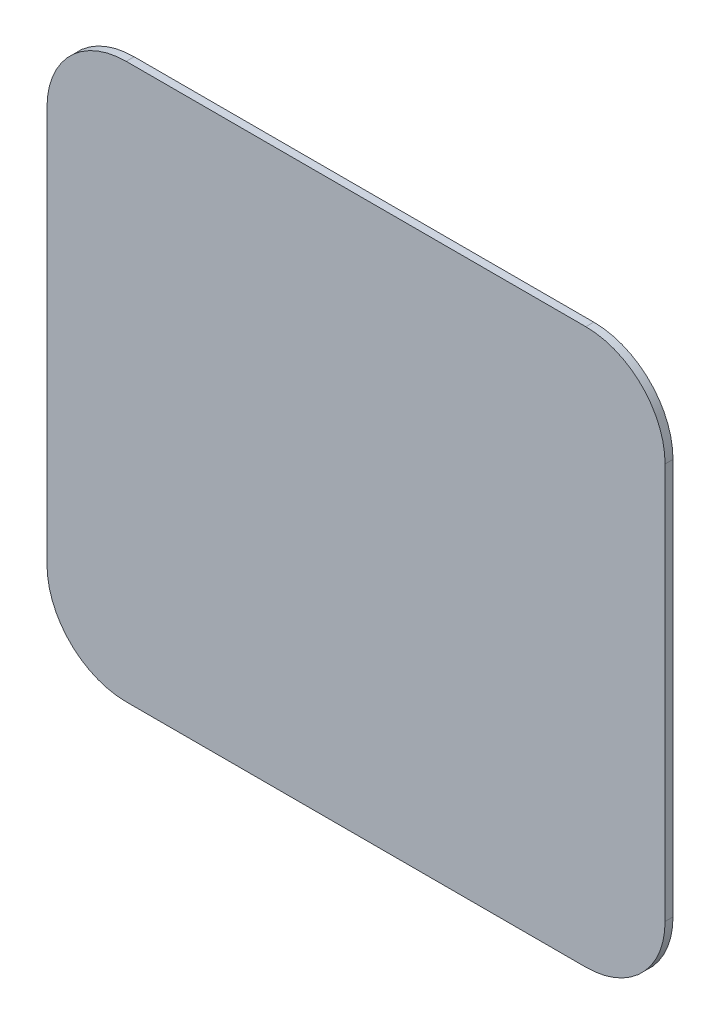
ISO-10303-21;
HEADER;
FILE_DESCRIPTION(('STEP AP214'),'2;1');
FILE_NAME('part.step','',(''),(''),'','','');
FILE_SCHEMA(('AUTOMOTIVE_DESIGN { 1 0 10303 214 1 1 1 1 }'));
ENDSEC;
DATA;
#1=APPLICATION_CONTEXT('core data for automotive mechanical design processes');
#2=APPLICATION_PROTOCOL_DEFINITION('international standard','automotive_design',2000,#1);
#3=PRODUCT_CONTEXT('',#1,'mechanical');
#4=PRODUCT('Part','Part','',(#3));
#5=PRODUCT_RELATED_PRODUCT_CATEGORY('part','',(#4));
#6=PRODUCT_DEFINITION_FORMATION('','',#4);
#7=PRODUCT_DEFINITION_CONTEXT('part definition',#1,'design');
#8=PRODUCT_DEFINITION('design','',#6,#7);
#9=PRODUCT_DEFINITION_SHAPE('','',#8);
#10=(LENGTH_UNIT() NAMED_UNIT(*) SI_UNIT(.MILLI.,.METRE.));
#11=(NAMED_UNIT(*) PLANE_ANGLE_UNIT() SI_UNIT($,.RADIAN.));
#12=(NAMED_UNIT(*) SI_UNIT($,.STERADIAN.) SOLID_ANGLE_UNIT());
#13=UNCERTAINTY_MEASURE_WITH_UNIT(LENGTH_MEASURE(1.E-05),#10,'distance_accuracy_value','');
#14=(GEOMETRIC_REPRESENTATION_CONTEXT(3) GLOBAL_UNCERTAINTY_ASSIGNED_CONTEXT((#13)) GLOBAL_UNIT_ASSIGNED_CONTEXT((#10,
#11,#12)) REPRESENTATION_CONTEXT('',''));
#15=CARTESIAN_POINT('',(0.,0.,0.));
#16=DIRECTION('',(0.,0.,1.));
#17=DIRECTION('',(1.,0.,0.));
#18=AXIS2_PLACEMENT_3D('',#15,#16,#17);
#19=CARTESIAN_POINT('',(38.9246009024166,39.9501900989278,1.));
#20=DIRECTION('',(-1.,0.,0.));
#21=DIRECTION('',(0.,-1.,0.));
#22=AXIS2_PLACEMENT_3D('',#19,#20,#21);
#23=PLANE('',#22);
#24=DIRECTION('',(0.,1.,0.));
#25=VECTOR('',#24,1.);
#26=CARTESIAN_POINT('',(38.9246009024166,39.9501900989278,1.));
#27=LINE('',#26,#25);
#28=CARTESIAN_POINT('',(38.9246009024166,-20.0498099010722,1.));
#29=VERTEX_POINT('',#28);
#30=CARTESIAN_POINT('',(38.9246009024166,29.9501900989278,1.));
#31=VERTEX_POINT('',#30);
#32=EDGE_CURVE('E128',#29,#31,#27,.T.);
#33=ORIENTED_EDGE('',*,*,#32,.F.);
#34=DIRECTION('',(0.,0.,-1.));
#35=VECTOR('',#34,1.);
#36=CARTESIAN_POINT('',(38.9246009024166,-20.0498099010722,1.));
#37=LINE('',#36,#35);
#38=CARTESIAN_POINT('',(38.9246009024166,-20.0498099010722,0.));
#39=VERTEX_POINT('',#38);
#40=EDGE_CURVE('E11',#29,#39,#37,.T.);
#41=ORIENTED_EDGE('',*,*,#40,.T.);
#42=DIRECTION('',(0.,1.,0.));
#43=VECTOR('',#42,1.);
#44=CARTESIAN_POINT('',(38.9246009024166,39.9501900989278,0.));
#45=LINE('',#44,#43);
#46=CARTESIAN_POINT('',(38.9246009024166,29.9501900989278,0.));
#47=VERTEX_POINT('',#46);
#48=EDGE_CURVE('E130',#39,#47,#45,.T.);
#49=ORIENTED_EDGE('',*,*,#48,.T.);
#50=DIRECTION('',(0.,0.,-1.));
#51=VECTOR('',#50,1.);
#52=CARTESIAN_POINT('',(38.9246009024166,29.9501900989278,1.));
#53=LINE('',#52,#51);
#54=EDGE_CURVE('E41',#47,#31,#53,.F.);
#55=ORIENTED_EDGE('',*,*,#54,.T.);
#56=EDGE_LOOP('',(#33,#41,#49,#55));
#57=FACE_BOUND('',#56,.T.);
#58=ADVANCED_FACE('F33',(#57),#23,.F.);
#59=CARTESIAN_POINT('',(-39.0753990975834,39.9501900989278,1.));
#60=DIRECTION('',(0.,-1.,0.));
#61=DIRECTION('',(0.,0.,-1.));
#62=AXIS2_PLACEMENT_3D('',#59,#60,#61);
#63=PLANE('',#62);
#64=DIRECTION('',(-1.,0.,0.));
#65=VECTOR('',#64,1.);
#66=CARTESIAN_POINT('',(-39.0753990975834,39.9501900989278,0.));
#67=LINE('',#66,#65);
#68=CARTESIAN_POINT('',(28.9246009024166,39.9501900989278,0.));
#69=VERTEX_POINT('',#68);
#70=CARTESIAN_POINT('',(-29.0753990975834,39.9501900989278,0.));
#71=VERTEX_POINT('',#70);
#72=EDGE_CURVE('E126',#69,#71,#67,.T.);
#73=ORIENTED_EDGE('',*,*,#72,.T.);
#74=DIRECTION('',(0.,0.,-1.));
#75=VECTOR('',#74,1.);
#76=CARTESIAN_POINT('',(-29.0753990975834,39.9501900989278,1.));
#77=LINE('',#76,#75);
#78=CARTESIAN_POINT('',(-29.0753990975834,39.9501900989278,1.));
#79=VERTEX_POINT('',#78);
#80=EDGE_CURVE('E105',#71,#79,#77,.F.);
#81=ORIENTED_EDGE('',*,*,#80,.T.);
#82=DIRECTION('',(-1.,0.,0.));
#83=VECTOR('',#82,1.);
#84=CARTESIAN_POINT('',(-39.0753990975834,39.9501900989278,1.));
#85=LINE('',#84,#83);
#86=CARTESIAN_POINT('',(28.9246009024166,39.9501900989278,1.));
#87=VERTEX_POINT('',#86);
#88=EDGE_CURVE('E166',#87,#79,#85,.T.);
#89=ORIENTED_EDGE('',*,*,#88,.F.);
#90=DIRECTION('',(0.,0.,-1.));
#91=VECTOR('',#90,1.);
#92=CARTESIAN_POINT('',(28.9246009024166,39.9501900989278,1.));
#93=LINE('',#92,#91);
#94=EDGE_CURVE('E110',#87,#69,#93,.T.);
#95=ORIENTED_EDGE('',*,*,#94,.T.);
#96=EDGE_LOOP('',(#73,#81,#89,#95));
#97=FACE_BOUND('',#96,.T.);
#98=ADVANCED_FACE('F170',(#97),#63,.F.);
#99=CARTESIAN_POINT('',(-39.0753990975834,39.9501900989278,1.));
#100=DIRECTION('',(1.,0.,0.));
#101=DIRECTION('',(0.,0.,-1.));
#102=AXIS2_PLACEMENT_3D('',#99,#100,#101);
#103=PLANE('',#102);
#104=DIRECTION('',(0.,-1.,0.));
#105=VECTOR('',#104,1.);
#106=CARTESIAN_POINT('',(-39.0753990975834,39.9501900989278,1.));
#107=LINE('',#106,#105);
#108=CARTESIAN_POINT('',(-39.0753990975834,29.9501900989278,1.));
#109=VERTEX_POINT('',#108);
#110=CARTESIAN_POINT('',(-39.0753990975834,-20.0498099010722,1.));
#111=VERTEX_POINT('',#110);
#112=EDGE_CURVE('E119',#109,#111,#107,.T.);
#113=ORIENTED_EDGE('',*,*,#112,.F.);
#114=DIRECTION('',(0.,0.,-1.));
#115=VECTOR('',#114,1.);
#116=CARTESIAN_POINT('',(-39.0753990975834,29.9501900989278,1.));
#117=LINE('',#116,#115);
#118=CARTESIAN_POINT('',(-39.0753990975834,29.9501900989278,0.));
#119=VERTEX_POINT('',#118);
#120=EDGE_CURVE('E104',#109,#119,#117,.T.);
#121=ORIENTED_EDGE('',*,*,#120,.T.);
#122=DIRECTION('',(0.,-1.,0.));
#123=VECTOR('',#122,1.);
#124=CARTESIAN_POINT('',(-39.0753990975834,39.9501900989278,0.));
#125=LINE('',#124,#123);
#126=CARTESIAN_POINT('',(-39.0753990975834,-20.0498099010722,0.));
#127=VERTEX_POINT('',#126);
#128=EDGE_CURVE('E117',#119,#127,#125,.T.);
#129=ORIENTED_EDGE('',*,*,#128,.T.);
#130=DIRECTION('',(0.,0.,-1.));
#131=VECTOR('',#130,1.);
#132=CARTESIAN_POINT('',(-39.0753990975834,-20.0498099010722,1.));
#133=LINE('',#132,#131);
#134=EDGE_CURVE('E121',#127,#111,#133,.F.);
#135=ORIENTED_EDGE('',*,*,#134,.T.);
#136=EDGE_LOOP('',(#113,#121,#129,#135));
#137=FACE_BOUND('',#136,.T.);
#138=ADVANCED_FACE('F116',(#137),#103,.F.);
#139=CARTESIAN_POINT('',(-39.0753990975834,-30.0498099010722,1.));
#140=DIRECTION('',(0.,1.,0.));
#141=DIRECTION('',(-1.,0.,0.));
#142=AXIS2_PLACEMENT_3D('',#139,#140,#141);
#143=PLANE('',#142);
#144=DIRECTION('',(1.,0.,0.));
#145=VECTOR('',#144,1.);
#146=CARTESIAN_POINT('',(-39.0753990975834,-30.0498099010722,1.));
#147=LINE('',#146,#145);
#148=CARTESIAN_POINT('',(-29.0753990975834,-30.0498099010722,1.));
#149=VERTEX_POINT('',#148);
#150=CARTESIAN_POINT('',(28.9246009024166,-30.0498099010722,1.));
#151=VERTEX_POINT('',#150);
#152=EDGE_CURVE('E134',#149,#151,#147,.T.);
#153=ORIENTED_EDGE('',*,*,#152,.F.);
#154=DIRECTION('',(0.,0.,-1.));
#155=VECTOR('',#154,1.);
#156=CARTESIAN_POINT('',(-29.0753990975834,-30.0498099010722,1.));
#157=LINE('',#156,#155);
#158=CARTESIAN_POINT('',(-29.0753990975834,-30.0498099010722,0.));
#159=VERTEX_POINT('',#158);
#160=EDGE_CURVE('E151',#149,#159,#157,.T.);
#161=ORIENTED_EDGE('',*,*,#160,.T.);
#162=DIRECTION('',(1.,0.,0.));
#163=VECTOR('',#162,1.);
#164=CARTESIAN_POINT('',(-39.0753990975834,-30.0498099010722,0.));
#165=LINE('',#164,#163);
#166=CARTESIAN_POINT('',(28.9246009024166,-30.0498099010722,0.));
#167=VERTEX_POINT('',#166);
#168=EDGE_CURVE('E125',#159,#167,#165,.T.);
#169=ORIENTED_EDGE('',*,*,#168,.T.);
#170=DIRECTION('',(0.,0.,-1.));
#171=VECTOR('',#170,1.);
#172=CARTESIAN_POINT('',(28.9246009024166,-30.0498099010722,1.));
#173=LINE('',#172,#171);
#174=EDGE_CURVE('E48',#167,#151,#173,.F.);
#175=ORIENTED_EDGE('',*,*,#174,.T.);
#176=EDGE_LOOP('',(#153,#161,#169,#175));
#177=FACE_BOUND('',#176,.T.);
#178=ADVANCED_FACE('F177',(#177),#143,.F.);
#179=CARTESIAN_POINT('',(0.,0.,1.));
#180=DIRECTION('',(0.,0.,1.));
#181=DIRECTION('',(1.,0.,0.));
#182=AXIS2_PLACEMENT_3D('',#179,#180,#181);
#183=PLANE('',#182);
#184=ORIENTED_EDGE('',*,*,#88,.T.);
#185=CARTESIAN_POINT('',(-29.0753990975834,29.9501900989278,1.));
#186=DIRECTION('',(0.,0.,1.));
#187=DIRECTION('',(1.,0.,0.));
#188=AXIS2_PLACEMENT_3D('',#185,#186,#187);
#189=CIRCLE('',#188,10.);
#190=EDGE_CURVE('E148',#79,#109,#189,.T.);
#191=ORIENTED_EDGE('',*,*,#190,.T.);
#192=ORIENTED_EDGE('',*,*,#112,.T.);
#193=CARTESIAN_POINT('',(-29.0753990975834,-20.0498099010722,1.));
#194=DIRECTION('',(0.,0.,1.));
#195=DIRECTION('',(1.,0.,0.));
#196=AXIS2_PLACEMENT_3D('',#193,#194,#195);
#197=CIRCLE('',#196,10.);
#198=EDGE_CURVE('E55',#111,#149,#197,.T.);
#199=ORIENTED_EDGE('',*,*,#198,.T.);
#200=ORIENTED_EDGE('',*,*,#152,.T.);
#201=CARTESIAN_POINT('',(28.9246009024166,-20.0498099010722,1.));
#202=DIRECTION('',(0.,0.,1.));
#203=DIRECTION('',(1.,0.,0.));
#204=AXIS2_PLACEMENT_3D('',#201,#202,#203);
#205=CIRCLE('',#204,10.);
#206=EDGE_CURVE('E145',#151,#29,#205,.T.);
#207=ORIENTED_EDGE('',*,*,#206,.T.);
#208=ORIENTED_EDGE('',*,*,#32,.T.);
#209=CARTESIAN_POINT('',(28.9246009024166,29.9501900989278,1.));
#210=DIRECTION('',(0.,0.,1.));
#211=DIRECTION('',(1.,0.,0.));
#212=AXIS2_PLACEMENT_3D('',#209,#210,#211);
#213=CIRCLE('',#212,10.);
#214=EDGE_CURVE('E143',#31,#87,#213,.T.);
#215=ORIENTED_EDGE('',*,*,#214,.T.);
#216=EDGE_LOOP('',(#184,#191,#192,#199,#200,#207,#208,#215));
#217=FACE_BOUND('',#216,.T.);
#218=ADVANCED_FACE('F163',(#217),#183,.T.);
#219=CARTESIAN_POINT('',(0.,0.,0.));
#220=DIRECTION('',(0.,0.,1.));
#221=DIRECTION('',(1.,0.,0.));
#222=AXIS2_PLACEMENT_3D('',#219,#220,#221);
#223=PLANE('',#222);
#224=ORIENTED_EDGE('',*,*,#128,.F.);
#225=CARTESIAN_POINT('',(-29.0753990975834,29.9501900989278,0.));
#226=DIRECTION('',(0.,0.,1.));
#227=DIRECTION('',(1.,0.,0.));
#228=AXIS2_PLACEMENT_3D('',#225,#226,#227);
#229=CIRCLE('',#228,10.);
#230=EDGE_CURVE('E100',#119,#71,#229,.F.);
#231=ORIENTED_EDGE('',*,*,#230,.T.);
#232=ORIENTED_EDGE('',*,*,#72,.F.);
#233=CARTESIAN_POINT('',(28.9246009024166,29.9501900989278,0.));
#234=DIRECTION('',(0.,0.,1.));
#235=DIRECTION('',(1.,0.,0.));
#236=AXIS2_PLACEMENT_3D('',#233,#234,#235);
#237=CIRCLE('',#236,10.);
#238=EDGE_CURVE('E120',#69,#47,#237,.F.);
#239=ORIENTED_EDGE('',*,*,#238,.T.);
#240=ORIENTED_EDGE('',*,*,#48,.F.);
#241=CARTESIAN_POINT('',(28.9246009024166,-20.0498099010722,0.));
#242=DIRECTION('',(0.,0.,1.));
#243=DIRECTION('',(1.,0.,0.));
#244=AXIS2_PLACEMENT_3D('',#241,#242,#243);
#245=CIRCLE('',#244,10.);
#246=EDGE_CURVE('E137',#39,#167,#245,.F.);
#247=ORIENTED_EDGE('',*,*,#246,.T.);
#248=ORIENTED_EDGE('',*,*,#168,.F.);
#249=CARTESIAN_POINT('',(-29.0753990975834,-20.0498099010722,0.));
#250=DIRECTION('',(0.,0.,1.));
#251=DIRECTION('',(1.,0.,0.));
#252=AXIS2_PLACEMENT_3D('',#249,#250,#251);
#253=CIRCLE('',#252,10.);
#254=EDGE_CURVE('E111',#159,#127,#253,.F.);
#255=ORIENTED_EDGE('',*,*,#254,.T.);
#256=EDGE_LOOP('',(#224,#231,#232,#239,#240,#247,#248,#255));
#257=FACE_BOUND('',#256,.T.);
#258=ADVANCED_FACE('F123',(#257),#223,.F.);
#259=CARTESIAN_POINT('',(-29.0753990975834,29.9501900989278,1.));
#260=DIRECTION('',(0.,0.,-1.));
#261=DIRECTION('',(-1.,0.,0.));
#262=AXIS2_PLACEMENT_3D('',#259,#260,#261);
#263=CYLINDRICAL_SURFACE('',#262,10.);
#264=ORIENTED_EDGE('',*,*,#190,.F.);
#265=ORIENTED_EDGE('',*,*,#80,.F.);
#266=ORIENTED_EDGE('',*,*,#230,.F.);
#267=ORIENTED_EDGE('',*,*,#120,.F.);
#268=EDGE_LOOP('',(#264,#265,#266,#267));
#269=FACE_BOUND('',#268,.T.);
#270=ADVANCED_FACE('F103',(#269),#263,.T.);
#271=CARTESIAN_POINT('',(-29.0753990975834,-20.0498099010722,1.));
#272=DIRECTION('',(0.,0.,-1.));
#273=DIRECTION('',(-1.,0.,0.));
#274=AXIS2_PLACEMENT_3D('',#271,#272,#273);
#275=CYLINDRICAL_SURFACE('',#274,10.);
#276=ORIENTED_EDGE('',*,*,#198,.F.);
#277=ORIENTED_EDGE('',*,*,#134,.F.);
#278=ORIENTED_EDGE('',*,*,#254,.F.);
#279=ORIENTED_EDGE('',*,*,#160,.F.);
#280=EDGE_LOOP('',(#276,#277,#278,#279));
#281=FACE_BOUND('',#280,.T.);
#282=ADVANCED_FACE('F176',(#281),#275,.T.);
#283=CARTESIAN_POINT('',(28.9246009024166,-20.0498099010722,1.));
#284=DIRECTION('',(0.,0.,-1.));
#285=DIRECTION('',(-1.,0.,0.));
#286=AXIS2_PLACEMENT_3D('',#283,#284,#285);
#287=CYLINDRICAL_SURFACE('',#286,10.);
#288=ORIENTED_EDGE('',*,*,#206,.F.);
#289=ORIENTED_EDGE('',*,*,#174,.F.);
#290=ORIENTED_EDGE('',*,*,#246,.F.);
#291=ORIENTED_EDGE('',*,*,#40,.F.);
#292=EDGE_LOOP('',(#288,#289,#290,#291));
#293=FACE_BOUND('',#292,.T.);
#294=ADVANCED_FACE('F179',(#293),#287,.T.);
#295=CARTESIAN_POINT('',(28.9246009024166,29.9501900989278,1.));
#296=DIRECTION('',(0.,0.,-1.));
#297=DIRECTION('',(-1.,0.,0.));
#298=AXIS2_PLACEMENT_3D('',#295,#296,#297);
#299=CYLINDRICAL_SURFACE('',#298,10.);
#300=ORIENTED_EDGE('',*,*,#214,.F.);
#301=ORIENTED_EDGE('',*,*,#54,.F.);
#302=ORIENTED_EDGE('',*,*,#238,.F.);
#303=ORIENTED_EDGE('',*,*,#94,.F.);
#304=EDGE_LOOP('',(#300,#301,#302,#303));
#305=FACE_BOUND('',#304,.T.);
#306=ADVANCED_FACE('F35',(#305),#299,.T.);
#307=CLOSED_SHELL('',(#58,#98,#138,#178,#218,#258,#270,#282,#294,#306));
#308=MANIFOLD_SOLID_BREP('B2',#307);
#309=ADVANCED_BREP_SHAPE_REPRESENTATION('',(#18,#308),#14);
#310=SHAPE_DEFINITION_REPRESENTATION(#9,#309);
ENDSEC;
END-ISO-10303-21;
